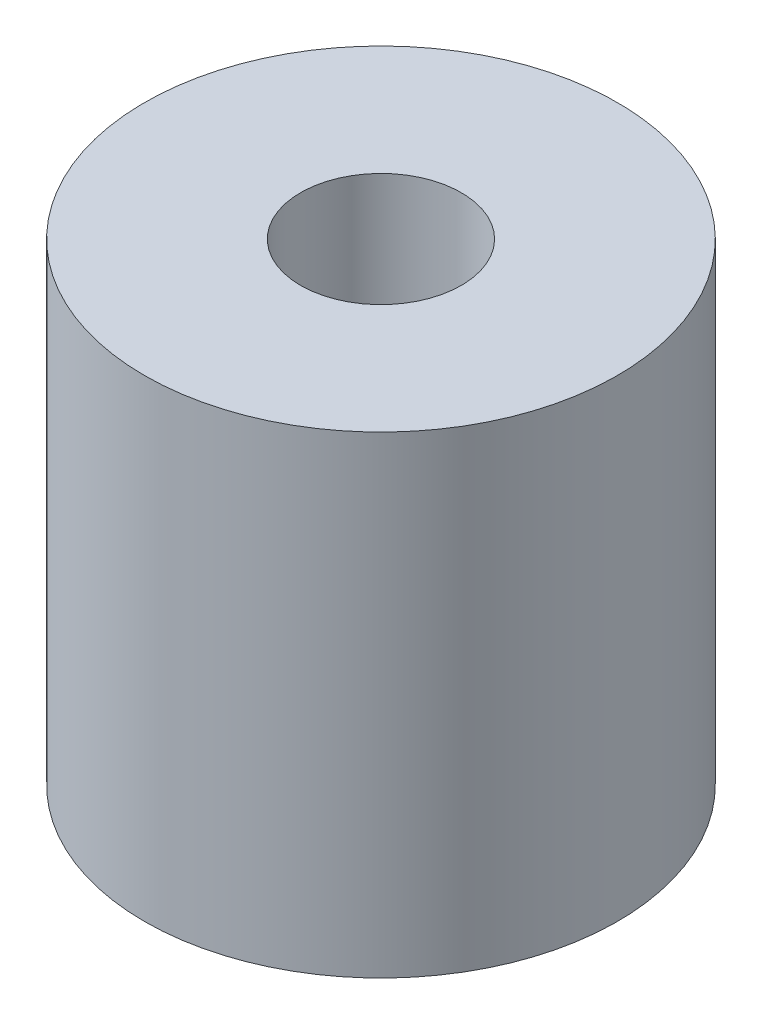
ISO-10303-21;
HEADER;
FILE_DESCRIPTION(('STEP AP214'),'2;1');
FILE_NAME('part.step','',(''),(''),'','','');
FILE_SCHEMA(('AUTOMOTIVE_DESIGN { 1 0 10303 214 1 1 1 1 }'));
ENDSEC;
DATA;
#1=APPLICATION_CONTEXT('core data for automotive mechanical design processes');
#2=APPLICATION_PROTOCOL_DEFINITION('international standard','automotive_design',2000,#1);
#3=PRODUCT_CONTEXT('',#1,'mechanical');
#4=PRODUCT('Part','Part','',(#3));
#5=PRODUCT_RELATED_PRODUCT_CATEGORY('part','',(#4));
#6=PRODUCT_DEFINITION_FORMATION('','',#4);
#7=PRODUCT_DEFINITION_CONTEXT('part definition',#1,'design');
#8=PRODUCT_DEFINITION('design','',#6,#7);
#9=PRODUCT_DEFINITION_SHAPE('','',#8);
#10=(LENGTH_UNIT() NAMED_UNIT(*) SI_UNIT(.MILLI.,.METRE.));
#11=(NAMED_UNIT(*) PLANE_ANGLE_UNIT() SI_UNIT($,.RADIAN.));
#12=(NAMED_UNIT(*) SI_UNIT($,.STERADIAN.) SOLID_ANGLE_UNIT());
#13=UNCERTAINTY_MEASURE_WITH_UNIT(LENGTH_MEASURE(1.E-05),#10,'distance_accuracy_value','');
#14=(GEOMETRIC_REPRESENTATION_CONTEXT(3) GLOBAL_UNCERTAINTY_ASSIGNED_CONTEXT((#13)) GLOBAL_UNIT_ASSIGNED_CONTEXT((#10,
#11,#12)) REPRESENTATION_CONTEXT('',''));
#15=CARTESIAN_POINT('',(0.,0.,0.));
#16=DIRECTION('',(0.,0.,1.));
#17=DIRECTION('',(1.,0.,0.));
#18=AXIS2_PLACEMENT_3D('',#15,#16,#17);
#19=CARTESIAN_POINT('',(0.,10.,0.));
#20=DIRECTION('',(0.,1.,0.));
#21=DIRECTION('',(0.,0.,1.));
#22=AXIS2_PLACEMENT_3D('',#19,#20,#21);
#23=PLANE('',#22);
#24=CARTESIAN_POINT('',(0.,10.,0.));
#25=DIRECTION('',(0.,1.,0.));
#26=DIRECTION('',(0.,0.,1.));
#27=AXIS2_PLACEMENT_3D('',#24,#25,#26);
#28=CIRCLE('',#27,5.);
#29=CARTESIAN_POINT('',(0.,10.,5.));
#30=VERTEX_POINT('',#29);
#31=EDGE_CURVE('E10',#30,#30,#28,.T.);
#32=ORIENTED_EDGE('',*,*,#31,.T.);
#33=EDGE_LOOP('',(#32));
#34=FACE_BOUND('',#33,.T.);
#35=CARTESIAN_POINT('',(0.,10.,0.));
#36=DIRECTION('',(0.,1.,0.));
#37=DIRECTION('',(0.,0.,1.));
#38=AXIS2_PLACEMENT_3D('',#35,#36,#37);
#39=CIRCLE('',#38,1.7);
#40=CARTESIAN_POINT('',(0.,10.,1.7));
#41=VERTEX_POINT('',#40);
#42=EDGE_CURVE('E45',#41,#41,#39,.T.);
#43=ORIENTED_EDGE('',*,*,#42,.F.);
#44=EDGE_LOOP('',(#43));
#45=FACE_BOUND('',#44,.T.);
#46=ADVANCED_FACE('F34',(#34,#45),#23,.T.);
#47=CARTESIAN_POINT('',(0.,0.,0.));
#48=DIRECTION('',(0.,1.,0.));
#49=DIRECTION('',(0.,0.,1.));
#50=AXIS2_PLACEMENT_3D('',#47,#48,#49);
#51=PLANE('',#50);
#52=CARTESIAN_POINT('',(0.,0.,0.));
#53=DIRECTION('',(0.,1.,0.));
#54=DIRECTION('',(0.,0.,1.));
#55=AXIS2_PLACEMENT_3D('',#52,#53,#54);
#56=CIRCLE('',#55,5.);
#57=CARTESIAN_POINT('',(0.,0.,5.));
#58=VERTEX_POINT('',#57);
#59=EDGE_CURVE('E38',#58,#58,#56,.T.);
#60=ORIENTED_EDGE('',*,*,#59,.F.);
#61=EDGE_LOOP('',(#60));
#62=FACE_BOUND('',#61,.T.);
#63=CARTESIAN_POINT('',(0.,0.,0.));
#64=DIRECTION('',(0.,1.,0.));
#65=DIRECTION('',(0.,0.,1.));
#66=AXIS2_PLACEMENT_3D('',#63,#64,#65);
#67=CIRCLE('',#66,1.7);
#68=CARTESIAN_POINT('',(0.,0.,1.7));
#69=VERTEX_POINT('',#68);
#70=EDGE_CURVE('E47',#69,#69,#67,.T.);
#71=ORIENTED_EDGE('',*,*,#70,.T.);
#72=EDGE_LOOP('',(#71));
#73=FACE_BOUND('',#72,.T.);
#74=ADVANCED_FACE('F57',(#62,#73),#51,.F.);
#75=CARTESIAN_POINT('',(0.,10.,0.));
#76=DIRECTION('',(0.,-1.,0.));
#77=DIRECTION('',(0.,0.,-1.));
#78=AXIS2_PLACEMENT_3D('',#75,#76,#77);
#79=CYLINDRICAL_SURFACE('',#78,5.);
#80=ORIENTED_EDGE('',*,*,#31,.F.);
#81=EDGE_LOOP('',(#80));
#82=FACE_BOUND('',#81,.T.);
#83=ORIENTED_EDGE('',*,*,#59,.T.);
#84=EDGE_LOOP('',(#83));
#85=FACE_BOUND('',#84,.T.);
#86=ADVANCED_FACE('F36',(#82,#85),#79,.T.);
#87=CARTESIAN_POINT('',(0.,10.,0.));
#88=DIRECTION('',(0.,-1.,0.));
#89=DIRECTION('',(0.,0.,-1.));
#90=AXIS2_PLACEMENT_3D('',#87,#88,#89);
#91=CYLINDRICAL_SURFACE('',#90,1.7);
#92=ORIENTED_EDGE('',*,*,#42,.T.);
#93=EDGE_LOOP('',(#92));
#94=FACE_BOUND('',#93,.T.);
#95=ORIENTED_EDGE('',*,*,#70,.F.);
#96=EDGE_LOOP('',(#95));
#97=FACE_BOUND('',#96,.T.);
#98=ADVANCED_FACE('F53',(#94,#97),#91,.F.);
#99=CLOSED_SHELL('',(#46,#74,#86,#98));
#100=MANIFOLD_SOLID_BREP('B2',#99);
#101=ADVANCED_BREP_SHAPE_REPRESENTATION('',(#18,#100),#14);
#102=SHAPE_DEFINITION_REPRESENTATION(#9,#101);
ENDSEC;
END-ISO-10303-21;
